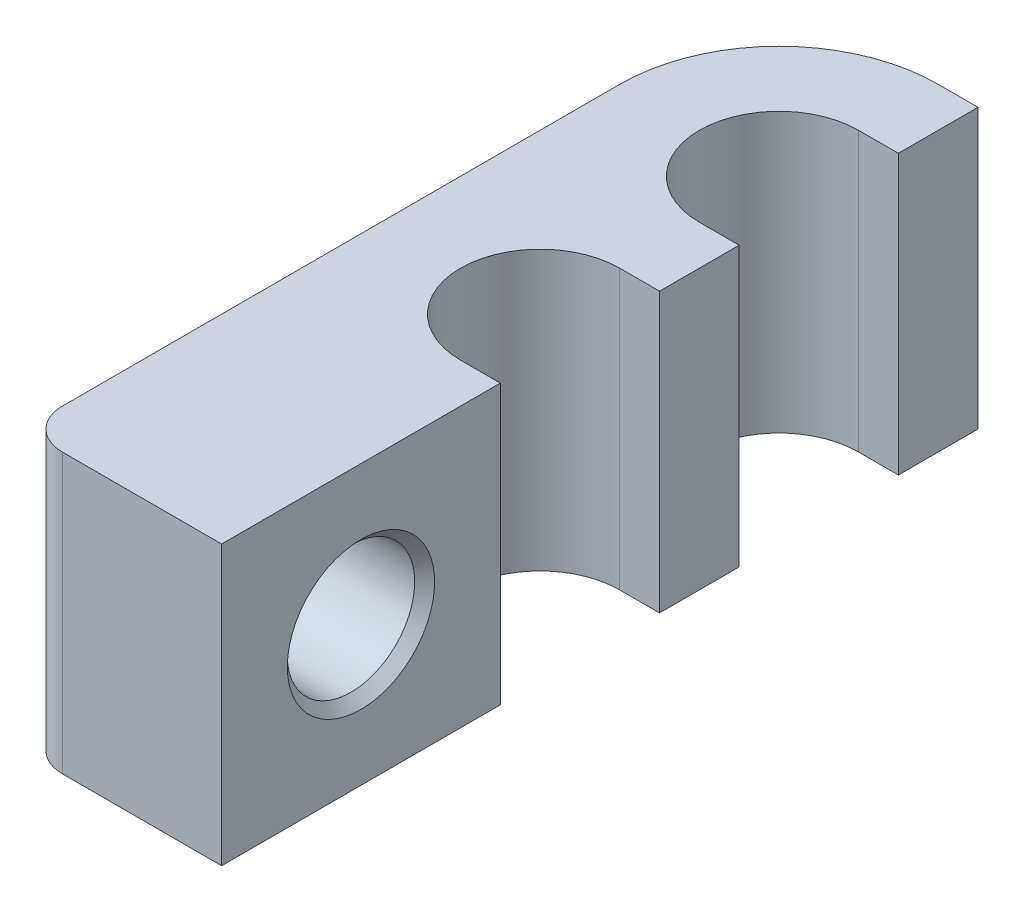
ISO-10303-21;
HEADER;
FILE_DESCRIPTION(('STEP AP214'),'2;1');
FILE_NAME('part.step','',(''),(''),'','','');
FILE_SCHEMA(('AUTOMOTIVE_DESIGN { 1 0 10303 214 1 1 1 1 }'));
ENDSEC;
DATA;
#1=APPLICATION_CONTEXT('core data for automotive mechanical design processes');
#2=APPLICATION_PROTOCOL_DEFINITION('international standard','automotive_design',2000,#1);
#3=PRODUCT_CONTEXT('',#1,'mechanical');
#4=PRODUCT('Part','Part','',(#3));
#5=PRODUCT_RELATED_PRODUCT_CATEGORY('part','',(#4));
#6=PRODUCT_DEFINITION_FORMATION('','',#4);
#7=PRODUCT_DEFINITION_CONTEXT('part definition',#1,'design');
#8=PRODUCT_DEFINITION('design','',#6,#7);
#9=PRODUCT_DEFINITION_SHAPE('','',#8);
#10=(LENGTH_UNIT() NAMED_UNIT(*) SI_UNIT(.MILLI.,.METRE.));
#11=(NAMED_UNIT(*) PLANE_ANGLE_UNIT() SI_UNIT($,.RADIAN.));
#12=(NAMED_UNIT(*) SI_UNIT($,.STERADIAN.) SOLID_ANGLE_UNIT());
#13=UNCERTAINTY_MEASURE_WITH_UNIT(LENGTH_MEASURE(1.E-05),#10,'distance_accuracy_value','');
#14=(GEOMETRIC_REPRESENTATION_CONTEXT(3) GLOBAL_UNCERTAINTY_ASSIGNED_CONTEXT((#13)) GLOBAL_UNIT_ASSIGNED_CONTEXT((#10,
#11,#12)) REPRESENTATION_CONTEXT('',''));
#15=CARTESIAN_POINT('',(0.,0.,0.));
#16=DIRECTION('',(0.,0.,1.));
#17=DIRECTION('',(1.,0.,0.));
#18=AXIS2_PLACEMENT_3D('',#15,#16,#17);
#19=CARTESIAN_POINT('',(0.,7.,0.));
#20=DIRECTION('',(-1.,0.,0.));
#21=DIRECTION('',(0.,0.,1.));
#22=AXIS2_PLACEMENT_3D('',#19,#20,#21);
#23=PLANE('',#22);
#24=CARTESIAN_POINT('',(0.,3.5,-3.5));
#25=DIRECTION('',(-1.,0.,0.));
#26=DIRECTION('',(0.,0.,1.));
#27=AXIS2_PLACEMENT_3D('',#24,#25,#26);
#28=CIRCLE('',#27,1.85);
#29=CARTESIAN_POINT('',(0.,3.5,-1.65000000000001));
#30=VERTEX_POINT('',#29);
#31=EDGE_CURVE('E176',#30,#30,#28,.T.);
#32=ORIENTED_EDGE('',*,*,#31,.T.);
#33=EDGE_LOOP('',(#32));
#34=FACE_BOUND('',#33,.T.);
#35=DIRECTION('',(0.,0.,-1.));
#36=VECTOR('',#35,1.);
#37=CARTESIAN_POINT('',(0.,0.,0.));
#38=LINE('',#37,#36);
#39=CARTESIAN_POINT('',(0.,0.,0.));
#40=VERTEX_POINT('',#39);
#41=CARTESIAN_POINT('',(0.,0.,-7.));
#42=VERTEX_POINT('',#41);
#43=EDGE_CURVE('E161',#40,#42,#38,.T.);
#44=ORIENTED_EDGE('',*,*,#43,.T.);
#45=DIRECTION('',(0.,-1.,0.));
#46=VECTOR('',#45,1.);
#47=CARTESIAN_POINT('',(0.,7.,-7.));
#48=LINE('',#47,#46);
#49=CARTESIAN_POINT('',(0.,7.,-7.));
#50=VERTEX_POINT('',#49);
#51=EDGE_CURVE('E142',#50,#42,#48,.T.);
#52=ORIENTED_EDGE('',*,*,#51,.F.);
#53=DIRECTION('',(0.,0.,-1.));
#54=VECTOR('',#53,1.);
#55=CARTESIAN_POINT('',(0.,7.,0.));
#56=LINE('',#55,#54);
#57=CARTESIAN_POINT('',(0.,7.,0.));
#58=VERTEX_POINT('',#57);
#59=EDGE_CURVE('E149',#58,#50,#56,.T.);
#60=ORIENTED_EDGE('',*,*,#59,.F.);
#61=DIRECTION('',(0.,-1.,0.));
#62=VECTOR('',#61,1.);
#63=CARTESIAN_POINT('',(0.,7.,0.));
#64=LINE('',#63,#62);
#65=EDGE_CURVE('E194',#58,#40,#64,.T.);
#66=ORIENTED_EDGE('',*,*,#65,.T.);
#67=EDGE_LOOP('',(#44,#52,#60,#66));
#68=FACE_BOUND('',#67,.T.);
#69=ADVANCED_FACE('F38',(#34,#68),#23,.F.);
#70=CARTESIAN_POINT('',(-0.999999999999999,7.,-7.));
#71=DIRECTION('',(0.,0.,1.));
#72=DIRECTION('',(1.,0.,0.));
#73=AXIS2_PLACEMENT_3D('',#70,#71,#72);
#74=PLANE('',#73);
#75=DIRECTION('',(-1.,0.,0.));
#76=VECTOR('',#75,1.);
#77=CARTESIAN_POINT('',(-0.999999999999999,0.,-7.));
#78=LINE('',#77,#76);
#79=CARTESIAN_POINT('',(-0.999999999999999,0.,-7.));
#80=VERTEX_POINT('',#79);
#81=EDGE_CURVE('E237',#42,#80,#78,.T.);
#82=ORIENTED_EDGE('',*,*,#81,.T.);
#83=DIRECTION('',(0.,-1.,0.));
#84=VECTOR('',#83,1.);
#85=CARTESIAN_POINT('',(-0.999999999999999,7.,-7.));
#86=LINE('',#85,#84);
#87=CARTESIAN_POINT('',(-0.999999999999999,7.,-7.));
#88=VERTEX_POINT('',#87);
#89=EDGE_CURVE('E145',#88,#80,#86,.T.);
#90=ORIENTED_EDGE('',*,*,#89,.F.);
#91=DIRECTION('',(-1.,0.,0.));
#92=VECTOR('',#91,1.);
#93=CARTESIAN_POINT('',(-0.999999999999999,7.,-7.));
#94=LINE('',#93,#92);
#95=EDGE_CURVE('E138',#50,#88,#94,.T.);
#96=ORIENTED_EDGE('',*,*,#95,.F.);
#97=ORIENTED_EDGE('',*,*,#51,.T.);
#98=EDGE_LOOP('',(#82,#90,#96,#97));
#99=FACE_BOUND('',#98,.T.);
#100=ADVANCED_FACE('F140',(#99),#74,.F.);
#101=CARTESIAN_POINT('',(-0.999999999999999,7.,-9.));
#102=DIRECTION('',(0.,-1.,0.));
#103=DIRECTION('',(0.,0.,-1.));
#104=AXIS2_PLACEMENT_3D('',#101,#102,#103);
#105=CYLINDRICAL_SURFACE('',#104,2.);
#106=CARTESIAN_POINT('',(-0.999999999999999,0.,-9.));
#107=DIRECTION('',(0.,-1.,0.));
#108=DIRECTION('',(0.,0.,1.));
#109=AXIS2_PLACEMENT_3D('',#106,#107,#108);
#110=CIRCLE('',#109,2.);
#111=CARTESIAN_POINT('',(-0.999999999999999,0.,-11.));
#112=VERTEX_POINT('',#111);
#113=EDGE_CURVE('E231',#80,#112,#110,.T.);
#114=ORIENTED_EDGE('',*,*,#113,.T.);
#115=DIRECTION('',(0.,-1.,0.));
#116=VECTOR('',#115,1.);
#117=CARTESIAN_POINT('',(-0.999999999999999,7.,-11.));
#118=LINE('',#117,#116);
#119=CARTESIAN_POINT('',(-0.999999999999999,7.,-11.));
#120=VERTEX_POINT('',#119);
#121=EDGE_CURVE('E167',#120,#112,#118,.T.);
#122=ORIENTED_EDGE('',*,*,#121,.F.);
#123=CARTESIAN_POINT('',(-0.999999999999999,7.,-9.));
#124=DIRECTION('',(0.,-1.,0.));
#125=DIRECTION('',(0.,0.,1.));
#126=AXIS2_PLACEMENT_3D('',#123,#124,#125);
#127=CIRCLE('',#126,2.);
#128=EDGE_CURVE('E148',#88,#120,#127,.T.);
#129=ORIENTED_EDGE('',*,*,#128,.F.);
#130=ORIENTED_EDGE('',*,*,#89,.T.);
#131=EDGE_LOOP('',(#114,#122,#129,#130));
#132=FACE_BOUND('',#131,.T.);
#133=ADVANCED_FACE('F266',(#132),#105,.F.);
#134=CARTESIAN_POINT('',(0.,7.,-11.));
#135=DIRECTION('',(0.,0.,-1.));
#136=DIRECTION('',(-1.,0.,0.));
#137=AXIS2_PLACEMENT_3D('',#134,#135,#136);
#138=PLANE('',#137);
#139=DIRECTION('',(1.,0.,0.));
#140=VECTOR('',#139,1.);
#141=CARTESIAN_POINT('',(0.,0.,-11.));
#142=LINE('',#141,#140);
#143=CARTESIAN_POINT('',(0.,0.,-11.));
#144=VERTEX_POINT('',#143);
#145=EDGE_CURVE('E226',#112,#144,#142,.T.);
#146=ORIENTED_EDGE('',*,*,#145,.T.);
#147=DIRECTION('',(0.,-1.,0.));
#148=VECTOR('',#147,1.);
#149=CARTESIAN_POINT('',(0.,7.,-11.));
#150=LINE('',#149,#148);
#151=CARTESIAN_POINT('',(0.,7.,-11.));
#152=VERTEX_POINT('',#151);
#153=EDGE_CURVE('E217',#152,#144,#150,.T.);
#154=ORIENTED_EDGE('',*,*,#153,.F.);
#155=DIRECTION('',(1.,0.,0.));
#156=VECTOR('',#155,1.);
#157=CARTESIAN_POINT('',(0.,7.,-11.));
#158=LINE('',#157,#156);
#159=EDGE_CURVE('E227',#120,#152,#158,.T.);
#160=ORIENTED_EDGE('',*,*,#159,.F.);
#161=ORIENTED_EDGE('',*,*,#121,.T.);
#162=EDGE_LOOP('',(#146,#154,#160,#161));
#163=FACE_BOUND('',#162,.T.);
#164=ADVANCED_FACE('F224',(#163),#138,.F.);
#165=CARTESIAN_POINT('',(0.,7.,-13.));
#166=DIRECTION('',(-1.,0.,0.));
#167=DIRECTION('',(0.,0.,1.));
#168=AXIS2_PLACEMENT_3D('',#165,#166,#167);
#169=PLANE('',#168);
#170=DIRECTION('',(0.,0.,-1.));
#171=VECTOR('',#170,1.);
#172=CARTESIAN_POINT('',(0.,0.,-13.));
#173=LINE('',#172,#171);
#174=CARTESIAN_POINT('',(0.,0.,-13.));
#175=VERTEX_POINT('',#174);
#176=EDGE_CURVE('E233',#144,#175,#173,.T.);
#177=ORIENTED_EDGE('',*,*,#176,.T.);
#178=DIRECTION('',(0.,-1.,0.));
#179=VECTOR('',#178,1.);
#180=CARTESIAN_POINT('',(0.,7.,-13.));
#181=LINE('',#180,#179);
#182=CARTESIAN_POINT('',(0.,7.,-13.));
#183=VERTEX_POINT('',#182);
#184=EDGE_CURVE('E214',#183,#175,#181,.T.);
#185=ORIENTED_EDGE('',*,*,#184,.F.);
#186=DIRECTION('',(0.,0.,-1.));
#187=VECTOR('',#186,1.);
#188=CARTESIAN_POINT('',(0.,7.,-13.));
#189=LINE('',#188,#187);
#190=EDGE_CURVE('E268',#152,#183,#189,.T.);
#191=ORIENTED_EDGE('',*,*,#190,.F.);
#192=ORIENTED_EDGE('',*,*,#153,.T.);
#193=EDGE_LOOP('',(#177,#185,#191,#192));
#194=FACE_BOUND('',#193,.T.);
#195=ADVANCED_FACE('F304',(#194),#169,.F.);
#196=CARTESIAN_POINT('',(0.,7.,-13.));
#197=DIRECTION('',(0.,0.,1.));
#198=DIRECTION('',(1.,0.,0.));
#199=AXIS2_PLACEMENT_3D('',#196,#197,#198);
#200=PLANE('',#199);
#201=DIRECTION('',(-1.,0.,0.));
#202=VECTOR('',#201,1.);
#203=CARTESIAN_POINT('',(0.,0.,-13.));
#204=LINE('',#203,#202);
#205=CARTESIAN_POINT('',(-1.,0.,-13.));
#206=VERTEX_POINT('',#205);
#207=EDGE_CURVE('E235',#175,#206,#204,.T.);
#208=ORIENTED_EDGE('',*,*,#207,.T.);
#209=DIRECTION('',(0.,-1.,0.));
#210=VECTOR('',#209,1.);
#211=CARTESIAN_POINT('',(-1.,7.,-13.));
#212=LINE('',#211,#210);
#213=CARTESIAN_POINT('',(-1.,7.,-13.));
#214=VERTEX_POINT('',#213);
#215=EDGE_CURVE('E211',#214,#206,#212,.T.);
#216=ORIENTED_EDGE('',*,*,#215,.F.);
#217=DIRECTION('',(-1.,0.,0.));
#218=VECTOR('',#217,1.);
#219=CARTESIAN_POINT('',(0.,7.,-13.));
#220=LINE('',#219,#218);
#221=EDGE_CURVE('E272',#183,#214,#220,.T.);
#222=ORIENTED_EDGE('',*,*,#221,.F.);
#223=ORIENTED_EDGE('',*,*,#184,.T.);
#224=EDGE_LOOP('',(#208,#216,#222,#223));
#225=FACE_BOUND('',#224,.T.);
#226=ADVANCED_FACE('F299',(#225),#200,.F.);
#227=CARTESIAN_POINT('',(-1.,7.,-15.));
#228=DIRECTION('',(0.,-1.,0.));
#229=DIRECTION('',(0.,0.,-1.));
#230=AXIS2_PLACEMENT_3D('',#227,#228,#229);
#231=CYLINDRICAL_SURFACE('',#230,2.);
#232=CARTESIAN_POINT('',(-1.,0.,-15.));
#233=DIRECTION('',(0.,-1.,0.));
#234=DIRECTION('',(0.,0.,-1.));
#235=AXIS2_PLACEMENT_3D('',#232,#233,#234);
#236=CIRCLE('',#235,2.);
#237=CARTESIAN_POINT('',(-1.,0.,-17.));
#238=VERTEX_POINT('',#237);
#239=EDGE_CURVE('E242',#206,#238,#236,.T.);
#240=ORIENTED_EDGE('',*,*,#239,.T.);
#241=DIRECTION('',(0.,-1.,0.));
#242=VECTOR('',#241,1.);
#243=CARTESIAN_POINT('',(-1.,7.,-17.));
#244=LINE('',#243,#242);
#245=CARTESIAN_POINT('',(-1.,7.,-17.));
#246=VERTEX_POINT('',#245);
#247=EDGE_CURVE('E208',#246,#238,#244,.T.);
#248=ORIENTED_EDGE('',*,*,#247,.F.);
#249=CARTESIAN_POINT('',(-1.,7.,-15.));
#250=DIRECTION('',(0.,-1.,0.));
#251=DIRECTION('',(0.,0.,-1.));
#252=AXIS2_PLACEMENT_3D('',#249,#250,#251);
#253=CIRCLE('',#252,2.);
#254=EDGE_CURVE('E274',#214,#246,#253,.T.);
#255=ORIENTED_EDGE('',*,*,#254,.F.);
#256=ORIENTED_EDGE('',*,*,#215,.T.);
#257=EDGE_LOOP('',(#240,#248,#255,#256));
#258=FACE_BOUND('',#257,.T.);
#259=ADVANCED_FACE('F296',(#258),#231,.F.);
#260=CARTESIAN_POINT('',(-1.,7.,-17.));
#261=DIRECTION('',(0.,0.,-1.));
#262=DIRECTION('',(-1.,0.,0.));
#263=AXIS2_PLACEMENT_3D('',#260,#261,#262);
#264=PLANE('',#263);
#265=DIRECTION('',(1.,0.,0.));
#266=VECTOR('',#265,1.);
#267=CARTESIAN_POINT('',(-1.,0.,-17.));
#268=LINE('',#267,#266);
#269=CARTESIAN_POINT('',(0.,0.,-17.));
#270=VERTEX_POINT('',#269);
#271=EDGE_CURVE('E244',#238,#270,#268,.T.);
#272=ORIENTED_EDGE('',*,*,#271,.T.);
#273=DIRECTION('',(0.,-1.,0.));
#274=VECTOR('',#273,1.);
#275=CARTESIAN_POINT('',(0.,7.,-17.));
#276=LINE('',#275,#274);
#277=CARTESIAN_POINT('',(0.,7.,-17.));
#278=VERTEX_POINT('',#277);
#279=EDGE_CURVE('E205',#278,#270,#276,.T.);
#280=ORIENTED_EDGE('',*,*,#279,.F.);
#281=DIRECTION('',(1.,0.,0.));
#282=VECTOR('',#281,1.);
#283=CARTESIAN_POINT('',(-1.,7.,-17.));
#284=LINE('',#283,#282);
#285=EDGE_CURVE('E276',#246,#278,#284,.T.);
#286=ORIENTED_EDGE('',*,*,#285,.F.);
#287=ORIENTED_EDGE('',*,*,#247,.T.);
#288=EDGE_LOOP('',(#272,#280,#286,#287));
#289=FACE_BOUND('',#288,.T.);
#290=ADVANCED_FACE('F292',(#289),#264,.F.);
#291=CARTESIAN_POINT('',(0.,7.,-17.));
#292=DIRECTION('',(-1.,0.,0.));
#293=DIRECTION('',(0.,0.,1.));
#294=AXIS2_PLACEMENT_3D('',#291,#292,#293);
#295=PLANE('',#294);
#296=DIRECTION('',(0.,0.,-1.));
#297=VECTOR('',#296,1.);
#298=CARTESIAN_POINT('',(0.,0.,-17.));
#299=LINE('',#298,#297);
#300=CARTESIAN_POINT('',(0.,0.,-19.));
#301=VERTEX_POINT('',#300);
#302=EDGE_CURVE('E246',#270,#301,#299,.T.);
#303=ORIENTED_EDGE('',*,*,#302,.T.);
#304=DIRECTION('',(0.,-1.,0.));
#305=VECTOR('',#304,1.);
#306=CARTESIAN_POINT('',(0.,7.,-19.));
#307=LINE('',#306,#305);
#308=CARTESIAN_POINT('',(0.,7.,-19.));
#309=VERTEX_POINT('',#308);
#310=EDGE_CURVE('E202',#309,#301,#307,.T.);
#311=ORIENTED_EDGE('',*,*,#310,.F.);
#312=DIRECTION('',(0.,0.,-1.));
#313=VECTOR('',#312,1.);
#314=CARTESIAN_POINT('',(0.,7.,-17.));
#315=LINE('',#314,#313);
#316=EDGE_CURVE('E278',#278,#309,#315,.T.);
#317=ORIENTED_EDGE('',*,*,#316,.F.);
#318=ORIENTED_EDGE('',*,*,#279,.T.);
#319=EDGE_LOOP('',(#303,#311,#317,#318));
#320=FACE_BOUND('',#319,.T.);
#321=ADVANCED_FACE('F288',(#320),#295,.F.);
#322=CARTESIAN_POINT('',(0.,7.,-19.));
#323=DIRECTION('',(0.,0.,1.));
#324=DIRECTION('',(1.,0.,0.));
#325=AXIS2_PLACEMENT_3D('',#322,#323,#324);
#326=PLANE('',#325);
#327=DIRECTION('',(-1.,0.,0.));
#328=VECTOR('',#327,1.);
#329=CARTESIAN_POINT('',(0.,0.,-19.));
#330=LINE('',#329,#328);
#331=CARTESIAN_POINT('',(-1.,0.,-19.));
#332=VERTEX_POINT('',#331);
#333=EDGE_CURVE('E248',#301,#332,#330,.T.);
#334=ORIENTED_EDGE('',*,*,#333,.T.);
#335=DIRECTION('',(0.,-1.,0.));
#336=VECTOR('',#335,1.);
#337=CARTESIAN_POINT('',(-1.,7.,-19.));
#338=LINE('',#337,#336);
#339=CARTESIAN_POINT('',(-1.,7.,-19.));
#340=VERTEX_POINT('',#339);
#341=EDGE_CURVE('E199',#340,#332,#338,.T.);
#342=ORIENTED_EDGE('',*,*,#341,.F.);
#343=DIRECTION('',(-1.,0.,0.));
#344=VECTOR('',#343,1.);
#345=CARTESIAN_POINT('',(0.,7.,-19.));
#346=LINE('',#345,#344);
#347=EDGE_CURVE('E262',#309,#340,#346,.T.);
#348=ORIENTED_EDGE('',*,*,#347,.F.);
#349=ORIENTED_EDGE('',*,*,#310,.T.);
#350=EDGE_LOOP('',(#334,#342,#348,#349));
#351=FACE_BOUND('',#350,.T.);
#352=ADVANCED_FACE('F283',(#351),#326,.F.);
#353=CARTESIAN_POINT('',(-1.,7.,-15.));
#354=DIRECTION('',(0.,-1.,0.));
#355=DIRECTION('',(0.,0.,-1.));
#356=AXIS2_PLACEMENT_3D('',#353,#354,#355);
#357=CYLINDRICAL_SURFACE('',#356,4.);
#358=CARTESIAN_POINT('',(-1.,0.,-15.));
#359=DIRECTION('',(0.,1.,0.));
#360=DIRECTION('',(0.,0.,1.));
#361=AXIS2_PLACEMENT_3D('',#358,#359,#360);
#362=CIRCLE('',#361,4.);
#363=CARTESIAN_POINT('',(-5.,0.,-15.));
#364=VERTEX_POINT('',#363);
#365=EDGE_CURVE('E190',#332,#364,#362,.T.);
#366=ORIENTED_EDGE('',*,*,#365,.T.);
#367=DIRECTION('',(0.,-1.,0.));
#368=VECTOR('',#367,1.);
#369=CARTESIAN_POINT('',(-5.,7.,-15.));
#370=LINE('',#369,#368);
#371=CARTESIAN_POINT('',(-5.,7.,-15.));
#372=VERTEX_POINT('',#371);
#373=EDGE_CURVE('E196',#372,#364,#370,.T.);
#374=ORIENTED_EDGE('',*,*,#373,.F.);
#375=CARTESIAN_POINT('',(-1.,7.,-15.));
#376=DIRECTION('',(0.,1.,0.));
#377=DIRECTION('',(0.,0.,1.));
#378=AXIS2_PLACEMENT_3D('',#375,#376,#377);
#379=CIRCLE('',#378,4.);
#380=EDGE_CURVE('E259',#340,#372,#379,.T.);
#381=ORIENTED_EDGE('',*,*,#380,.F.);
#382=ORIENTED_EDGE('',*,*,#341,.T.);
#383=EDGE_LOOP('',(#366,#374,#381,#382));
#384=FACE_BOUND('',#383,.T.);
#385=ADVANCED_FACE('F253',(#384),#357,.T.);
#386=CARTESIAN_POINT('',(-5.,7.,0.));
#387=DIRECTION('',(1.,0.,0.));
#388=DIRECTION('',(0.,0.,-1.));
#389=AXIS2_PLACEMENT_3D('',#386,#387,#388);
#390=PLANE('',#389);
#391=CARTESIAN_POINT('',(-5.,3.5,-3.5));
#392=DIRECTION('',(1.,0.,0.));
#393=DIRECTION('',(0.,0.,-1.));
#394=AXIS2_PLACEMENT_3D('',#391,#392,#393);
#395=CIRCLE('',#394,1.84999999999998);
#396=CARTESIAN_POINT('',(-5.,3.5,-5.34999999999998));
#397=VERTEX_POINT('',#396);
#398=EDGE_CURVE('E173',#397,#397,#395,.T.);
#399=ORIENTED_EDGE('',*,*,#398,.T.);
#400=EDGE_LOOP('',(#399));
#401=FACE_BOUND('',#400,.T.);
#402=DIRECTION('',(0.,0.,1.));
#403=VECTOR('',#402,1.);
#404=CARTESIAN_POINT('',(-5.,0.,0.));
#405=LINE('',#404,#403);
#406=CARTESIAN_POINT('',(-5.,0.,-0.999999999999999));
#407=VERTEX_POINT('',#406);
#408=EDGE_CURVE('E188',#364,#407,#405,.T.);
#409=ORIENTED_EDGE('',*,*,#408,.T.);
#410=DIRECTION('',(0.,-1.,0.));
#411=VECTOR('',#410,1.);
#412=CARTESIAN_POINT('',(-5.,7.,-0.999999999999999));
#413=LINE('',#412,#411);
#414=CARTESIAN_POINT('',(-5.,7.,-0.999999999999999));
#415=VERTEX_POINT('',#414);
#416=EDGE_CURVE('E46',#407,#415,#413,.F.);
#417=ORIENTED_EDGE('',*,*,#416,.T.);
#418=DIRECTION('',(0.,0.,1.));
#419=VECTOR('',#418,1.);
#420=CARTESIAN_POINT('',(-5.,7.,-15.));
#421=LINE('',#420,#419);
#422=EDGE_CURVE('E258',#372,#415,#421,.T.);
#423=ORIENTED_EDGE('',*,*,#422,.F.);
#424=ORIENTED_EDGE('',*,*,#373,.T.);
#425=EDGE_LOOP('',(#409,#417,#423,#424));
#426=FACE_BOUND('',#425,.T.);
#427=ADVANCED_FACE('F257',(#401,#426),#390,.F.);
#428=CARTESIAN_POINT('',(0.,7.,0.));
#429=DIRECTION('',(0.,0.,-1.));
#430=DIRECTION('',(-1.,0.,0.));
#431=AXIS2_PLACEMENT_3D('',#428,#429,#430);
#432=PLANE('',#431);
#433=DIRECTION('',(1.,0.,0.));
#434=VECTOR('',#433,1.);
#435=CARTESIAN_POINT('',(0.,7.,0.));
#436=LINE('',#435,#434);
#437=CARTESIAN_POINT('',(-4.,7.,0.));
#438=VERTEX_POINT('',#437);
#439=EDGE_CURVE('E154',#438,#58,#436,.T.);
#440=ORIENTED_EDGE('',*,*,#439,.F.);
#441=DIRECTION('',(0.,-1.,0.));
#442=VECTOR('',#441,1.);
#443=CARTESIAN_POINT('',(-4.,7.,0.));
#444=LINE('',#443,#442);
#445=CARTESIAN_POINT('',(-4.,0.,0.));
#446=VERTEX_POINT('',#445);
#447=EDGE_CURVE('E179',#438,#446,#444,.T.);
#448=ORIENTED_EDGE('',*,*,#447,.T.);
#449=DIRECTION('',(1.,0.,0.));
#450=VECTOR('',#449,1.);
#451=CARTESIAN_POINT('',(0.,0.,0.));
#452=LINE('',#451,#450);
#453=EDGE_CURVE('E158',#446,#40,#452,.T.);
#454=ORIENTED_EDGE('',*,*,#453,.T.);
#455=ORIENTED_EDGE('',*,*,#65,.F.);
#456=EDGE_LOOP('',(#440,#448,#454,#455));
#457=FACE_BOUND('',#456,.T.);
#458=ADVANCED_FACE('F184',(#457),#432,.F.);
#459=CARTESIAN_POINT('',(-0.999999999999999,7.,-9.));
#460=DIRECTION('',(0.,1.,0.));
#461=DIRECTION('',(0.,0.,1.));
#462=AXIS2_PLACEMENT_3D('',#459,#460,#461);
#463=PLANE('',#462);
#464=ORIENTED_EDGE('',*,*,#422,.T.);
#465=CARTESIAN_POINT('',(-4.,7.,-1.));
#466=DIRECTION('',(0.,1.,0.));
#467=DIRECTION('',(0.,0.,1.));
#468=AXIS2_PLACEMENT_3D('',#465,#466,#467);
#469=CIRCLE('',#468,1.);
#470=EDGE_CURVE('E11',#415,#438,#469,.T.);
#471=ORIENTED_EDGE('',*,*,#470,.T.);
#472=ORIENTED_EDGE('',*,*,#439,.T.);
#473=ORIENTED_EDGE('',*,*,#59,.T.);
#474=ORIENTED_EDGE('',*,*,#95,.T.);
#475=ORIENTED_EDGE('',*,*,#128,.T.);
#476=ORIENTED_EDGE('',*,*,#159,.T.);
#477=ORIENTED_EDGE('',*,*,#190,.T.);
#478=ORIENTED_EDGE('',*,*,#221,.T.);
#479=ORIENTED_EDGE('',*,*,#254,.T.);
#480=ORIENTED_EDGE('',*,*,#285,.T.);
#481=ORIENTED_EDGE('',*,*,#316,.T.);
#482=ORIENTED_EDGE('',*,*,#347,.T.);
#483=ORIENTED_EDGE('',*,*,#380,.T.);
#484=EDGE_LOOP('',(#464,#471,#472,#473,#474,#475,#476,#477,#478,#479,#480,#481,#482,#483));
#485=FACE_BOUND('',#484,.T.);
#486=ADVANCED_FACE('F152',(#485),#463,.T.);
#487=CARTESIAN_POINT('',(-0.999999999999999,0.,-9.));
#488=DIRECTION('',(0.,1.,0.));
#489=DIRECTION('',(0.,0.,1.));
#490=AXIS2_PLACEMENT_3D('',#487,#488,#489);
#491=PLANE('',#490);
#492=ORIENTED_EDGE('',*,*,#453,.F.);
#493=CARTESIAN_POINT('',(-4.,0.,-1.));
#494=DIRECTION('',(0.,1.,0.));
#495=DIRECTION('',(0.,0.,1.));
#496=AXIS2_PLACEMENT_3D('',#493,#494,#495);
#497=CIRCLE('',#496,1.);
#498=EDGE_CURVE('E60',#446,#407,#497,.F.);
#499=ORIENTED_EDGE('',*,*,#498,.T.);
#500=ORIENTED_EDGE('',*,*,#408,.F.);
#501=ORIENTED_EDGE('',*,*,#365,.F.);
#502=ORIENTED_EDGE('',*,*,#333,.F.);
#503=ORIENTED_EDGE('',*,*,#302,.F.);
#504=ORIENTED_EDGE('',*,*,#271,.F.);
#505=ORIENTED_EDGE('',*,*,#239,.F.);
#506=ORIENTED_EDGE('',*,*,#207,.F.);
#507=ORIENTED_EDGE('',*,*,#176,.F.);
#508=ORIENTED_EDGE('',*,*,#145,.F.);
#509=ORIENTED_EDGE('',*,*,#113,.F.);
#510=ORIENTED_EDGE('',*,*,#81,.F.);
#511=ORIENTED_EDGE('',*,*,#43,.F.);
#512=EDGE_LOOP('',(#492,#499,#500,#501,#502,#503,#504,#505,#506,#507,#508,#509,#510,#511));
#513=FACE_BOUND('',#512,.T.);
#514=ADVANCED_FACE('F187',(#513),#491,.F.);
#515=CARTESIAN_POINT('',(-5.,3.5,-3.5));
#516=DIRECTION('',(-1.,0.,0.));
#517=DIRECTION('',(0.,0.,1.));
#518=AXIS2_PLACEMENT_3D('',#515,#516,#517);
#519=CYLINDRICAL_SURFACE('',#518,1.59999999999999);
#520=CARTESIAN_POINT('',(-4.75000000000001,3.5,-3.5));
#521=DIRECTION('',(1.,0.,0.));
#522=DIRECTION('',(0.,0.,-1.));
#523=AXIS2_PLACEMENT_3D('',#520,#521,#522);
#524=CIRCLE('',#523,1.59999999999999);
#525=CARTESIAN_POINT('',(-4.75000000000001,3.5,-5.09999999999999));
#526=VERTEX_POINT('',#525);
#527=EDGE_CURVE('E165',#526,#526,#524,.F.);
#528=ORIENTED_EDGE('',*,*,#527,.T.);
#529=EDGE_LOOP('',(#528));
#530=FACE_BOUND('',#529,.T.);
#531=CARTESIAN_POINT('',(-0.250000000000005,3.5,-3.5));
#532=DIRECTION('',(-1.,0.,0.));
#533=DIRECTION('',(0.,0.,1.));
#534=AXIS2_PLACEMENT_3D('',#531,#532,#533);
#535=CIRCLE('',#534,1.59999999999999);
#536=CARTESIAN_POINT('',(-0.250000000000002,3.5,-1.90000000000001));
#537=VERTEX_POINT('',#536);
#538=EDGE_CURVE('E162',#537,#537,#535,.F.);
#539=ORIENTED_EDGE('',*,*,#538,.T.);
#540=EDGE_LOOP('',(#539));
#541=FACE_BOUND('',#540,.T.);
#542=ADVANCED_FACE('F329',(#530,#541),#519,.F.);
#543=CARTESIAN_POINT('',(-4.75000000000001,3.5,-3.5));
#544=DIRECTION('',(-1.,0.,0.));
#545=DIRECTION('',(0.,0.,1.));
#546=AXIS2_PLACEMENT_3D('',#543,#544,#545);
#547=CONICAL_SURFACE('',#546,1.59999999999999,0.785398163397453);
#548=ORIENTED_EDGE('',*,*,#398,.F.);
#549=EDGE_LOOP('',(#548));
#550=FACE_BOUND('',#549,.T.);
#551=ORIENTED_EDGE('',*,*,#527,.F.);
#552=EDGE_LOOP('',(#551));
#553=FACE_BOUND('',#552,.T.);
#554=ADVANCED_FACE('F323',(#550,#553),#547,.F.);
#555=CARTESIAN_POINT('',(0.,3.5,-3.5));
#556=DIRECTION('',(1.,0.,0.));
#557=DIRECTION('',(0.,0.,-1.));
#558=AXIS2_PLACEMENT_3D('',#555,#556,#557);
#559=CONICAL_SURFACE('',#558,1.85,0.78539816339745);
#560=ORIENTED_EDGE('',*,*,#538,.F.);
#561=EDGE_LOOP('',(#560));
#562=FACE_BOUND('',#561,.T.);
#563=ORIENTED_EDGE('',*,*,#31,.F.);
#564=EDGE_LOOP('',(#563));
#565=FACE_BOUND('',#564,.T.);
#566=ADVANCED_FACE('F328',(#562,#565),#559,.F.);
#567=CARTESIAN_POINT('',(-4.,7.,-1.));
#568=DIRECTION('',(0.,-1.,0.));
#569=DIRECTION('',(0.,0.,-1.));
#570=AXIS2_PLACEMENT_3D('',#567,#568,#569);
#571=CYLINDRICAL_SURFACE('',#570,1.);
#572=ORIENTED_EDGE('',*,*,#470,.F.);
#573=ORIENTED_EDGE('',*,*,#416,.F.);
#574=ORIENTED_EDGE('',*,*,#498,.F.);
#575=ORIENTED_EDGE('',*,*,#447,.F.);
#576=EDGE_LOOP('',(#572,#573,#574,#575));
#577=FACE_BOUND('',#576,.T.);
#578=ADVANCED_FACE('F40',(#577),#571,.T.);
#579=CLOSED_SHELL('',(#69,#100,#133,#164,#195,#226,#259,#290,#321,#352,#385,#427,#458,#486,#514,
#542,#554,#566,#578));
#580=MANIFOLD_SOLID_BREP('B2',#579);
#581=ADVANCED_BREP_SHAPE_REPRESENTATION('',(#18,#580),#14);
#582=SHAPE_DEFINITION_REPRESENTATION(#9,#581);
ENDSEC;
END-ISO-10303-21;
